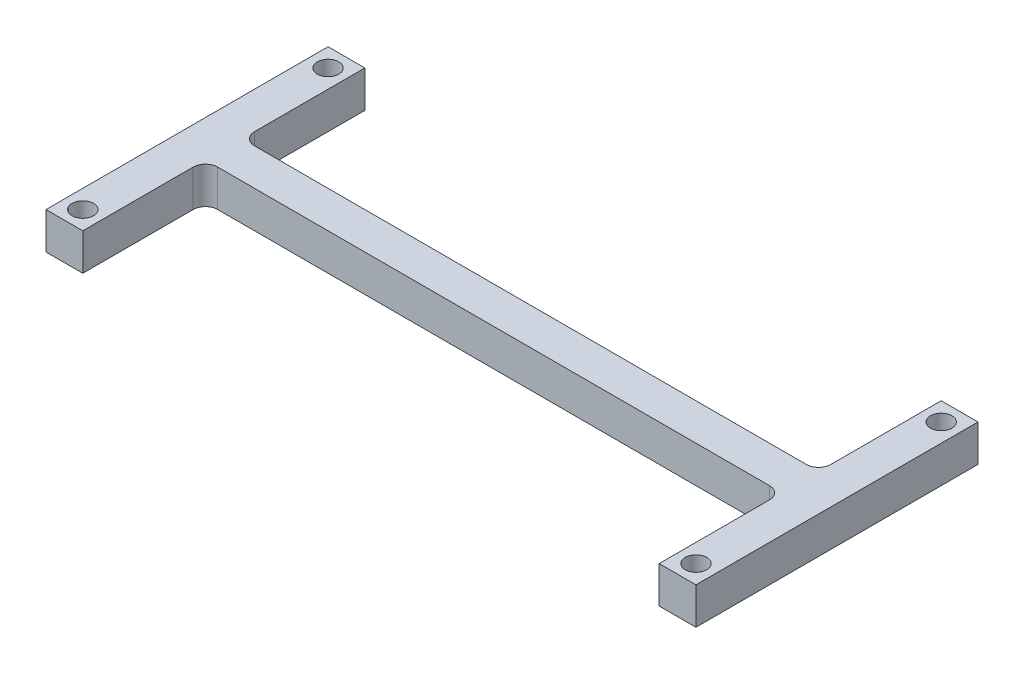
ISO-10303-21;
HEADER;
FILE_DESCRIPTION(('STEP AP214'),'2;1');
FILE_NAME('part.step','',(''),(''),'','','');
FILE_SCHEMA(('AUTOMOTIVE_DESIGN { 1 0 10303 214 1 1 1 1 }'));
ENDSEC;
DATA;
#1=APPLICATION_CONTEXT('core data for automotive mechanical design processes');
#2=APPLICATION_PROTOCOL_DEFINITION('international standard','automotive_design',2000,#1);
#3=PRODUCT_CONTEXT('',#1,'mechanical');
#4=PRODUCT('Part','Part','',(#3));
#5=PRODUCT_RELATED_PRODUCT_CATEGORY('part','',(#4));
#6=PRODUCT_DEFINITION_FORMATION('','',#4);
#7=PRODUCT_DEFINITION_CONTEXT('part definition',#1,'design');
#8=PRODUCT_DEFINITION('design','',#6,#7);
#9=PRODUCT_DEFINITION_SHAPE('','',#8);
#10=(LENGTH_UNIT() NAMED_UNIT(*) SI_UNIT(.MILLI.,.METRE.));
#11=(NAMED_UNIT(*) PLANE_ANGLE_UNIT() SI_UNIT($,.RADIAN.));
#12=(NAMED_UNIT(*) SI_UNIT($,.STERADIAN.) SOLID_ANGLE_UNIT());
#13=UNCERTAINTY_MEASURE_WITH_UNIT(LENGTH_MEASURE(1.E-05),#10,'distance_accuracy_value','');
#14=(GEOMETRIC_REPRESENTATION_CONTEXT(3) GLOBAL_UNCERTAINTY_ASSIGNED_CONTEXT((#13)) GLOBAL_UNIT_ASSIGNED_CONTEXT((#10,
#11,#12)) REPRESENTATION_CONTEXT('',''));
#15=CARTESIAN_POINT('',(0.,0.,0.));
#16=DIRECTION('',(0.,0.,1.));
#17=DIRECTION('',(1.,0.,0.));
#18=AXIS2_PLACEMENT_3D('',#15,#16,#17);
#19=CARTESIAN_POINT('',(-53.,6.,3.));
#20=DIRECTION('',(0.,0.,-1.));
#21=DIRECTION('',(-1.,0.,0.));
#22=AXIS2_PLACEMENT_3D('',#19,#20,#21);
#23=PLANE('',#22);
#24=DIRECTION('',(1.,0.,0.));
#25=VECTOR('',#24,1.);
#26=CARTESIAN_POINT('',(-53.,6.,3.));
#27=LINE('',#26,#25);
#28=CARTESIAN_POINT('',(-45.,6.,3.));
#29=VERTEX_POINT('',#28);
#30=CARTESIAN_POINT('',(45.,6.,3.));
#31=VERTEX_POINT('',#30);
#32=EDGE_CURVE('E300',#29,#31,#27,.T.);
#33=ORIENTED_EDGE('',*,*,#32,.F.);
#34=DIRECTION('',(0.,1.,0.));
#35=VECTOR('',#34,1.);
#36=CARTESIAN_POINT('',(-45.,6.,3.));
#37=LINE('',#36,#35);
#38=CARTESIAN_POINT('',(-45.,0.,3.));
#39=VERTEX_POINT('',#38);
#40=EDGE_CURVE('E324',#29,#39,#37,.F.);
#41=ORIENTED_EDGE('',*,*,#40,.T.);
#42=DIRECTION('',(1.,0.,0.));
#43=VECTOR('',#42,1.);
#44=CARTESIAN_POINT('',(-53.,0.,3.));
#45=LINE('',#44,#43);
#46=CARTESIAN_POINT('',(45.,0.,3.));
#47=VERTEX_POINT('',#46);
#48=EDGE_CURVE('E294',#39,#47,#45,.T.);
#49=ORIENTED_EDGE('',*,*,#48,.T.);
#50=DIRECTION('',(0.,1.,0.));
#51=VECTOR('',#50,1.);
#52=CARTESIAN_POINT('',(45.,6.,3.));
#53=LINE('',#52,#51);
#54=EDGE_CURVE('E320',#47,#31,#53,.T.);
#55=ORIENTED_EDGE('',*,*,#54,.T.);
#56=EDGE_LOOP('',(#33,#41,#49,#55));
#57=FACE_BOUND('',#56,.T.);
#58=ADVANCED_FACE('F44',(#57),#23,.F.);
#59=CARTESIAN_POINT('',(53.,6.,3.));
#60=DIRECTION('',(-1.,0.,0.));
#61=DIRECTION('',(0.,0.,1.));
#62=AXIS2_PLACEMENT_3D('',#59,#60,#61);
#63=PLANE('',#62);
#64=DIRECTION('',(0.,0.,-1.));
#65=VECTOR('',#64,1.);
#66=CARTESIAN_POINT('',(53.,0.,3.));
#67=LINE('',#66,#65);
#68=CARTESIAN_POINT('',(53.,0.,23.));
#69=VERTEX_POINT('',#68);
#70=CARTESIAN_POINT('',(53.,0.,-23.));
#71=VERTEX_POINT('',#70);
#72=EDGE_CURVE('E287',#69,#71,#67,.T.);
#73=ORIENTED_EDGE('',*,*,#72,.T.);
#74=DIRECTION('',(0.,1.,0.));
#75=VECTOR('',#74,1.);
#76=CARTESIAN_POINT('',(53.,0.,-23.));
#77=LINE('',#76,#75);
#78=CARTESIAN_POINT('',(53.,6.,-23.));
#79=VERTEX_POINT('',#78);
#80=EDGE_CURVE('E168',#71,#79,#77,.T.);
#81=ORIENTED_EDGE('',*,*,#80,.T.);
#82=DIRECTION('',(0.,0.,-1.));
#83=VECTOR('',#82,1.);
#84=CARTESIAN_POINT('',(53.,6.,3.));
#85=LINE('',#84,#83);
#86=CARTESIAN_POINT('',(53.,6.,23.));
#87=VERTEX_POINT('',#86);
#88=EDGE_CURVE('E175',#87,#79,#85,.T.);
#89=ORIENTED_EDGE('',*,*,#88,.F.);
#90=DIRECTION('',(0.,1.,0.));
#91=VECTOR('',#90,1.);
#92=CARTESIAN_POINT('',(53.,0.,23.));
#93=LINE('',#92,#91);
#94=EDGE_CURVE('E197',#69,#87,#93,.T.);
#95=ORIENTED_EDGE('',*,*,#94,.F.);
#96=EDGE_LOOP('',(#73,#81,#89,#95));
#97=FACE_BOUND('',#96,.T.);
#98=ADVANCED_FACE('F415',(#97),#63,.F.);
#99=CARTESIAN_POINT('',(-53.,6.,-3.));
#100=DIRECTION('',(0.,0.,1.));
#101=DIRECTION('',(1.,0.,0.));
#102=AXIS2_PLACEMENT_3D('',#99,#100,#101);
#103=PLANE('',#102);
#104=DIRECTION('',(-1.,0.,0.));
#105=VECTOR('',#104,1.);
#106=CARTESIAN_POINT('',(-53.,6.,-3.));
#107=LINE('',#106,#105);
#108=CARTESIAN_POINT('',(45.,6.,-3.));
#109=VERTEX_POINT('',#108);
#110=CARTESIAN_POINT('',(-45.,6.,-3.));
#111=VERTEX_POINT('',#110);
#112=EDGE_CURVE('E293',#109,#111,#107,.T.);
#113=ORIENTED_EDGE('',*,*,#112,.F.);
#114=DIRECTION('',(0.,1.,0.));
#115=VECTOR('',#114,1.);
#116=CARTESIAN_POINT('',(45.,6.,-3.));
#117=LINE('',#116,#115);
#118=CARTESIAN_POINT('',(45.,0.,-3.));
#119=VERTEX_POINT('',#118);
#120=EDGE_CURVE('E336',#109,#119,#117,.F.);
#121=ORIENTED_EDGE('',*,*,#120,.T.);
#122=DIRECTION('',(-1.,0.,0.));
#123=VECTOR('',#122,1.);
#124=CARTESIAN_POINT('',(-53.,0.,-3.));
#125=LINE('',#124,#123);
#126=CARTESIAN_POINT('',(-45.,0.,-3.));
#127=VERTEX_POINT('',#126);
#128=EDGE_CURVE('E307',#119,#127,#125,.T.);
#129=ORIENTED_EDGE('',*,*,#128,.T.);
#130=DIRECTION('',(0.,1.,0.));
#131=VECTOR('',#130,1.);
#132=CARTESIAN_POINT('',(-45.,6.,-3.));
#133=LINE('',#132,#131);
#134=EDGE_CURVE('E332',#127,#111,#133,.T.);
#135=ORIENTED_EDGE('',*,*,#134,.T.);
#136=EDGE_LOOP('',(#113,#121,#129,#135));
#137=FACE_BOUND('',#136,.T.);
#138=ADVANCED_FACE('F369',(#137),#103,.F.);
#139=CARTESIAN_POINT('',(-53.,6.,3.));
#140=DIRECTION('',(1.,0.,0.));
#141=DIRECTION('',(0.,0.,-1.));
#142=AXIS2_PLACEMENT_3D('',#139,#140,#141);
#143=PLANE('',#142);
#144=DIRECTION('',(0.,0.,1.));
#145=VECTOR('',#144,1.);
#146=CARTESIAN_POINT('',(-53.,0.,3.));
#147=LINE('',#146,#145);
#148=CARTESIAN_POINT('',(-53.,0.,-23.));
#149=VERTEX_POINT('',#148);
#150=CARTESIAN_POINT('',(-53.,0.,23.));
#151=VERTEX_POINT('',#150);
#152=EDGE_CURVE('E311',#149,#151,#147,.T.);
#153=ORIENTED_EDGE('',*,*,#152,.T.);
#154=DIRECTION('',(0.,1.,0.));
#155=VECTOR('',#154,1.);
#156=CARTESIAN_POINT('',(-53.,0.,23.));
#157=LINE('',#156,#155);
#158=CARTESIAN_POINT('',(-53.,6.,23.));
#159=VERTEX_POINT('',#158);
#160=EDGE_CURVE('E230',#151,#159,#157,.T.);
#161=ORIENTED_EDGE('',*,*,#160,.T.);
#162=DIRECTION('',(0.,0.,1.));
#163=VECTOR('',#162,1.);
#164=CARTESIAN_POINT('',(-53.,6.,3.));
#165=LINE('',#164,#163);
#166=CARTESIAN_POINT('',(-53.,6.,-23.));
#167=VERTEX_POINT('',#166);
#168=EDGE_CURVE('E297',#167,#159,#165,.T.);
#169=ORIENTED_EDGE('',*,*,#168,.F.);
#170=DIRECTION('',(0.,1.,0.));
#171=VECTOR('',#170,1.);
#172=CARTESIAN_POINT('',(-53.,0.,-23.));
#173=LINE('',#172,#171);
#174=EDGE_CURVE('E283',#149,#167,#173,.T.);
#175=ORIENTED_EDGE('',*,*,#174,.F.);
#176=EDGE_LOOP('',(#153,#161,#169,#175));
#177=FACE_BOUND('',#176,.T.);
#178=ADVANCED_FACE('F383',(#177),#143,.F.);
#179=CARTESIAN_POINT('',(0.,6.,0.));
#180=DIRECTION('',(0.,-1.,0.));
#181=DIRECTION('',(0.,0.,-1.));
#182=AXIS2_PLACEMENT_3D('',#179,#180,#181);
#183=PLANE('',#182);
#184=ORIENTED_EDGE('',*,*,#88,.T.);
#185=DIRECTION('',(-1.,0.,0.));
#186=VECTOR('',#185,1.);
#187=CARTESIAN_POINT('',(53.,6.,-23.));
#188=LINE('',#187,#186);
#189=CARTESIAN_POINT('',(47.,6.,-23.));
#190=VERTEX_POINT('',#189);
#191=EDGE_CURVE('E160',#79,#190,#188,.T.);
#192=ORIENTED_EDGE('',*,*,#191,.T.);
#193=DIRECTION('',(0.,0.,1.));
#194=VECTOR('',#193,1.);
#195=CARTESIAN_POINT('',(47.,6.,-3.));
#196=LINE('',#195,#194);
#197=CARTESIAN_POINT('',(47.,6.,-5.));
#198=VERTEX_POINT('',#197);
#199=EDGE_CURVE('E173',#190,#198,#196,.T.);
#200=ORIENTED_EDGE('',*,*,#199,.T.);
#201=CARTESIAN_POINT('',(45.,6.,-5.));
#202=DIRECTION('',(0.,-1.,0.));
#203=DIRECTION('',(0.,0.,-1.));
#204=AXIS2_PLACEMENT_3D('',#201,#202,#203);
#205=CIRCLE('',#204,2.);
#206=EDGE_CURVE('E353',#198,#109,#205,.T.);
#207=ORIENTED_EDGE('',*,*,#206,.T.);
#208=ORIENTED_EDGE('',*,*,#112,.T.);
#209=CARTESIAN_POINT('',(-45.,6.,-5.));
#210=DIRECTION('',(0.,-1.,0.));
#211=DIRECTION('',(0.,0.,-1.));
#212=AXIS2_PLACEMENT_3D('',#209,#210,#211);
#213=CIRCLE('',#212,2.);
#214=CARTESIAN_POINT('',(-47.,6.,-5.));
#215=VERTEX_POINT('',#214);
#216=EDGE_CURVE('E53',#111,#215,#213,.T.);
#217=ORIENTED_EDGE('',*,*,#216,.T.);
#218=DIRECTION('',(0.,0.,-1.));
#219=VECTOR('',#218,1.);
#220=CARTESIAN_POINT('',(-47.,6.,-3.));
#221=LINE('',#220,#219);
#222=CARTESIAN_POINT('',(-47.,6.,-23.));
#223=VERTEX_POINT('',#222);
#224=EDGE_CURVE('E265',#215,#223,#221,.T.);
#225=ORIENTED_EDGE('',*,*,#224,.T.);
#226=DIRECTION('',(-1.,0.,0.));
#227=VECTOR('',#226,1.);
#228=CARTESIAN_POINT('',(-53.,6.,-23.));
#229=LINE('',#228,#227);
#230=EDGE_CURVE('E273',#223,#167,#229,.T.);
#231=ORIENTED_EDGE('',*,*,#230,.T.);
#232=ORIENTED_EDGE('',*,*,#168,.T.);
#233=DIRECTION('',(1.,0.,0.));
#234=VECTOR('',#233,1.);
#235=CARTESIAN_POINT('',(-53.,6.,23.));
#236=LINE('',#235,#234);
#237=CARTESIAN_POINT('',(-47.,6.,23.));
#238=VERTEX_POINT('',#237);
#239=EDGE_CURVE('E241',#159,#238,#236,.T.);
#240=ORIENTED_EDGE('',*,*,#239,.T.);
#241=DIRECTION('',(0.,0.,-1.));
#242=VECTOR('',#241,1.);
#243=CARTESIAN_POINT('',(-47.,6.,3.));
#244=LINE('',#243,#242);
#245=CARTESIAN_POINT('',(-47.,6.,5.));
#246=VERTEX_POINT('',#245);
#247=EDGE_CURVE('E237',#238,#246,#244,.T.);
#248=ORIENTED_EDGE('',*,*,#247,.T.);
#249=CARTESIAN_POINT('',(-45.,6.,5.));
#250=DIRECTION('',(0.,-1.,0.));
#251=DIRECTION('',(0.,0.,-1.));
#252=AXIS2_PLACEMENT_3D('',#249,#250,#251);
#253=CIRCLE('',#252,2.);
#254=EDGE_CURVE('E341',#246,#29,#253,.T.);
#255=ORIENTED_EDGE('',*,*,#254,.T.);
#256=ORIENTED_EDGE('',*,*,#32,.T.);
#257=CARTESIAN_POINT('',(45.,6.,5.));
#258=DIRECTION('',(0.,-1.,0.));
#259=DIRECTION('',(0.,0.,-1.));
#260=AXIS2_PLACEMENT_3D('',#257,#258,#259);
#261=CIRCLE('',#260,2.);
#262=CARTESIAN_POINT('',(47.,6.,5.));
#263=VERTEX_POINT('',#262);
#264=EDGE_CURVE('E347',#31,#263,#261,.T.);
#265=ORIENTED_EDGE('',*,*,#264,.T.);
#266=DIRECTION('',(0.,0.,1.));
#267=VECTOR('',#266,1.);
#268=CARTESIAN_POINT('',(47.,6.,3.));
#269=LINE('',#268,#267);
#270=CARTESIAN_POINT('',(47.,6.,23.));
#271=VERTEX_POINT('',#270);
#272=EDGE_CURVE('E212',#263,#271,#269,.T.);
#273=ORIENTED_EDGE('',*,*,#272,.T.);
#274=DIRECTION('',(1.,0.,0.));
#275=VECTOR('',#274,1.);
#276=CARTESIAN_POINT('',(53.,6.,23.));
#277=LINE('',#276,#275);
#278=EDGE_CURVE('E209',#271,#87,#277,.T.);
#279=ORIENTED_EDGE('',*,*,#278,.T.);
#280=EDGE_LOOP('',(#184,#192,#200,#207,#208,#217,#225,#231,#232,#240,#248,#255,#256,#265,#273,#279));
#281=FACE_BOUND('',#280,.T.);
#282=CARTESIAN_POINT('',(-50.,6.,-20.));
#283=DIRECTION('',(0.,1.,0.));
#284=DIRECTION('',(0.,0.,1.));
#285=AXIS2_PLACEMENT_3D('',#282,#283,#284);
#286=CIRCLE('',#285,1.75);
#287=CARTESIAN_POINT('',(-50.,6.,-18.25));
#288=VERTEX_POINT('',#287);
#289=EDGE_CURVE('E257',#288,#288,#286,.T.);
#290=ORIENTED_EDGE('',*,*,#289,.F.);
#291=EDGE_LOOP('',(#290));
#292=FACE_BOUND('',#291,.T.);
#293=CARTESIAN_POINT('',(-50.,6.,20.));
#294=DIRECTION('',(0.,1.,0.));
#295=DIRECTION('',(0.,0.,-1.));
#296=AXIS2_PLACEMENT_3D('',#293,#294,#295);
#297=CIRCLE('',#296,1.75);
#298=CARTESIAN_POINT('',(-50.,6.,18.25));
#299=VERTEX_POINT('',#298);
#300=EDGE_CURVE('E253',#299,#299,#297,.T.);
#301=ORIENTED_EDGE('',*,*,#300,.F.);
#302=EDGE_LOOP('',(#301));
#303=FACE_BOUND('',#302,.T.);
#304=CARTESIAN_POINT('',(50.,6.,20.));
#305=DIRECTION('',(0.,1.,0.));
#306=DIRECTION('',(0.,0.,1.));
#307=AXIS2_PLACEMENT_3D('',#304,#305,#306);
#308=CIRCLE('',#307,1.75);
#309=CARTESIAN_POINT('',(50.,6.,21.75));
#310=VERTEX_POINT('',#309);
#311=EDGE_CURVE('E222',#310,#310,#308,.T.);
#312=ORIENTED_EDGE('',*,*,#311,.F.);
#313=EDGE_LOOP('',(#312));
#314=FACE_BOUND('',#313,.T.);
#315=CARTESIAN_POINT('',(50.,6.,-20.));
#316=DIRECTION('',(0.,1.,0.));
#317=DIRECTION('',(0.,0.,-1.));
#318=AXIS2_PLACEMENT_3D('',#315,#316,#317);
#319=CIRCLE('',#318,1.75);
#320=CARTESIAN_POINT('',(50.,6.,-21.75));
#321=VERTEX_POINT('',#320);
#322=EDGE_CURVE('E193',#321,#321,#319,.T.);
#323=ORIENTED_EDGE('',*,*,#322,.F.);
#324=EDGE_LOOP('',(#323));
#325=FACE_BOUND('',#324,.T.);
#326=ADVANCED_FACE('F171',(#281,#292,#303,#314,#325),#183,.F.);
#327=CARTESIAN_POINT('',(0.,0.,0.));
#328=DIRECTION('',(0.,-1.,0.));
#329=DIRECTION('',(0.,0.,-1.));
#330=AXIS2_PLACEMENT_3D('',#327,#328,#329);
#331=PLANE('',#330);
#332=ORIENTED_EDGE('',*,*,#72,.F.);
#333=DIRECTION('',(1.,0.,0.));
#334=VECTOR('',#333,1.);
#335=CARTESIAN_POINT('',(53.,0.,23.));
#336=LINE('',#335,#334);
#337=CARTESIAN_POINT('',(47.,0.,23.));
#338=VERTEX_POINT('',#337);
#339=EDGE_CURVE('E205',#338,#69,#336,.T.);
#340=ORIENTED_EDGE('',*,*,#339,.F.);
#341=DIRECTION('',(0.,0.,1.));
#342=VECTOR('',#341,1.);
#343=CARTESIAN_POINT('',(47.,0.,3.));
#344=LINE('',#343,#342);
#345=CARTESIAN_POINT('',(47.,0.,5.));
#346=VERTEX_POINT('',#345);
#347=EDGE_CURVE('E213',#346,#338,#344,.T.);
#348=ORIENTED_EDGE('',*,*,#347,.F.);
#349=CARTESIAN_POINT('',(45.,0.,5.));
#350=DIRECTION('',(0.,-1.,0.));
#351=DIRECTION('',(0.,0.,-1.));
#352=AXIS2_PLACEMENT_3D('',#349,#350,#351);
#353=CIRCLE('',#352,2.);
#354=EDGE_CURVE('E350',#346,#47,#353,.F.);
#355=ORIENTED_EDGE('',*,*,#354,.T.);
#356=ORIENTED_EDGE('',*,*,#48,.F.);
#357=CARTESIAN_POINT('',(-45.,0.,5.));
#358=DIRECTION('',(0.,-1.,0.));
#359=DIRECTION('',(0.,0.,-1.));
#360=AXIS2_PLACEMENT_3D('',#357,#358,#359);
#361=CIRCLE('',#360,2.);
#362=CARTESIAN_POINT('',(-47.,0.,5.));
#363=VERTEX_POINT('',#362);
#364=EDGE_CURVE('E344',#39,#363,#361,.F.);
#365=ORIENTED_EDGE('',*,*,#364,.T.);
#366=DIRECTION('',(0.,0.,-1.));
#367=VECTOR('',#366,1.);
#368=CARTESIAN_POINT('',(-47.,0.,3.));
#369=LINE('',#368,#367);
#370=CARTESIAN_POINT('',(-47.,0.,23.));
#371=VERTEX_POINT('',#370);
#372=EDGE_CURVE('E234',#371,#363,#369,.T.);
#373=ORIENTED_EDGE('',*,*,#372,.F.);
#374=DIRECTION('',(1.,0.,0.));
#375=VECTOR('',#374,1.);
#376=CARTESIAN_POINT('',(-53.,0.,23.));
#377=LINE('',#376,#375);
#378=EDGE_CURVE('E242',#151,#371,#377,.T.);
#379=ORIENTED_EDGE('',*,*,#378,.F.);
#380=ORIENTED_EDGE('',*,*,#152,.F.);
#381=DIRECTION('',(-1.,0.,0.));
#382=VECTOR('',#381,1.);
#383=CARTESIAN_POINT('',(-53.,0.,-23.));
#384=LINE('',#383,#382);
#385=CARTESIAN_POINT('',(-47.,0.,-23.));
#386=VERTEX_POINT('',#385);
#387=EDGE_CURVE('E272',#386,#149,#384,.T.);
#388=ORIENTED_EDGE('',*,*,#387,.F.);
#389=DIRECTION('',(0.,0.,-1.));
#390=VECTOR('',#389,1.);
#391=CARTESIAN_POINT('',(-47.,0.,-3.));
#392=LINE('',#391,#390);
#393=CARTESIAN_POINT('',(-47.,0.,-5.));
#394=VERTEX_POINT('',#393);
#395=EDGE_CURVE('E269',#394,#386,#392,.T.);
#396=ORIENTED_EDGE('',*,*,#395,.F.);
#397=CARTESIAN_POINT('',(-45.,0.,-5.));
#398=DIRECTION('',(0.,-1.,0.));
#399=DIRECTION('',(0.,0.,-1.));
#400=AXIS2_PLACEMENT_3D('',#397,#398,#399);
#401=CIRCLE('',#400,2.);
#402=EDGE_CURVE('E11',#394,#127,#401,.F.);
#403=ORIENTED_EDGE('',*,*,#402,.T.);
#404=ORIENTED_EDGE('',*,*,#128,.F.);
#405=CARTESIAN_POINT('',(45.,0.,-5.));
#406=DIRECTION('',(0.,-1.,0.));
#407=DIRECTION('',(0.,0.,-1.));
#408=AXIS2_PLACEMENT_3D('',#405,#406,#407);
#409=CIRCLE('',#408,2.);
#410=CARTESIAN_POINT('',(47.,0.,-5.));
#411=VERTEX_POINT('',#410);
#412=EDGE_CURVE('E356',#119,#411,#409,.F.);
#413=ORIENTED_EDGE('',*,*,#412,.T.);
#414=DIRECTION('',(0.,0.,1.));
#415=VECTOR('',#414,1.);
#416=CARTESIAN_POINT('',(47.,0.,-3.));
#417=LINE('',#416,#415);
#418=CARTESIAN_POINT('',(47.,0.,-23.));
#419=VERTEX_POINT('',#418);
#420=EDGE_CURVE('E187',#419,#411,#417,.T.);
#421=ORIENTED_EDGE('',*,*,#420,.F.);
#422=DIRECTION('',(-1.,0.,0.));
#423=VECTOR('',#422,1.);
#424=CARTESIAN_POINT('',(53.,0.,-23.));
#425=LINE('',#424,#423);
#426=EDGE_CURVE('E162',#71,#419,#425,.T.);
#427=ORIENTED_EDGE('',*,*,#426,.F.);
#428=EDGE_LOOP('',(#332,#340,#348,#355,#356,#365,#373,#379,#380,#388,#396,#403,#404,#413,#421,#427));
#429=FACE_BOUND('',#428,.T.);
#430=CARTESIAN_POINT('',(-50.,0.,-20.));
#431=DIRECTION('',(0.,1.,0.));
#432=DIRECTION('',(0.,0.,1.));
#433=AXIS2_PLACEMENT_3D('',#430,#431,#432);
#434=CIRCLE('',#433,1.75);
#435=CARTESIAN_POINT('',(-50.,0.,-18.25));
#436=VERTEX_POINT('',#435);
#437=EDGE_CURVE('E261',#436,#436,#434,.T.);
#438=ORIENTED_EDGE('',*,*,#437,.T.);
#439=EDGE_LOOP('',(#438));
#440=FACE_BOUND('',#439,.T.);
#441=CARTESIAN_POINT('',(-50.,0.,20.));
#442=DIRECTION('',(0.,1.,0.));
#443=DIRECTION('',(0.,0.,-1.));
#444=AXIS2_PLACEMENT_3D('',#441,#442,#443);
#445=CIRCLE('',#444,1.75);
#446=CARTESIAN_POINT('',(-50.,0.,18.25));
#447=VERTEX_POINT('',#446);
#448=EDGE_CURVE('E246',#447,#447,#445,.T.);
#449=ORIENTED_EDGE('',*,*,#448,.T.);
#450=EDGE_LOOP('',(#449));
#451=FACE_BOUND('',#450,.T.);
#452=CARTESIAN_POINT('',(50.,0.,20.));
#453=DIRECTION('',(0.,1.,0.));
#454=DIRECTION('',(0.,0.,1.));
#455=AXIS2_PLACEMENT_3D('',#452,#453,#454);
#456=CIRCLE('',#455,1.75);
#457=CARTESIAN_POINT('',(50.,0.,21.75));
#458=VERTEX_POINT('',#457);
#459=EDGE_CURVE('E216',#458,#458,#456,.T.);
#460=ORIENTED_EDGE('',*,*,#459,.T.);
#461=EDGE_LOOP('',(#460));
#462=FACE_BOUND('',#461,.T.);
#463=CARTESIAN_POINT('',(50.,0.,-20.));
#464=DIRECTION('',(0.,1.,0.));
#465=DIRECTION('',(0.,0.,-1.));
#466=AXIS2_PLACEMENT_3D('',#463,#464,#465);
#467=CIRCLE('',#466,1.75);
#468=CARTESIAN_POINT('',(50.,0.,-21.75));
#469=VERTEX_POINT('',#468);
#470=EDGE_CURVE('E178',#469,#469,#467,.T.);
#471=ORIENTED_EDGE('',*,*,#470,.T.);
#472=EDGE_LOOP('',(#471));
#473=FACE_BOUND('',#472,.T.);
#474=ADVANCED_FACE('F362',(#429,#440,#451,#462,#473),#331,.T.);
#475=CARTESIAN_POINT('',(-53.,0.,-23.));
#476=DIRECTION('',(0.,0.,-1.));
#477=DIRECTION('',(-1.,0.,0.));
#478=AXIS2_PLACEMENT_3D('',#475,#476,#477);
#479=PLANE('',#478);
#480=ORIENTED_EDGE('',*,*,#230,.F.);
#481=DIRECTION('',(0.,1.,0.));
#482=VECTOR('',#481,1.);
#483=CARTESIAN_POINT('',(-47.,0.,-23.));
#484=LINE('',#483,#482);
#485=EDGE_CURVE('E277',#386,#223,#484,.T.);
#486=ORIENTED_EDGE('',*,*,#485,.F.);
#487=ORIENTED_EDGE('',*,*,#387,.T.);
#488=ORIENTED_EDGE('',*,*,#174,.T.);
#489=EDGE_LOOP('',(#480,#486,#487,#488));
#490=FACE_BOUND('',#489,.T.);
#491=ADVANCED_FACE('F378',(#490),#479,.T.);
#492=CARTESIAN_POINT('',(-47.,0.,-3.));
#493=DIRECTION('',(1.,0.,0.));
#494=DIRECTION('',(0.,0.,-1.));
#495=AXIS2_PLACEMENT_3D('',#492,#493,#494);
#496=PLANE('',#495);
#497=ORIENTED_EDGE('',*,*,#224,.F.);
#498=DIRECTION('',(0.,1.,0.));
#499=VECTOR('',#498,1.);
#500=CARTESIAN_POINT('',(-47.,0.,-5.));
#501=LINE('',#500,#499);
#502=EDGE_CURVE('E60',#215,#394,#501,.F.);
#503=ORIENTED_EDGE('',*,*,#502,.T.);
#504=ORIENTED_EDGE('',*,*,#395,.T.);
#505=ORIENTED_EDGE('',*,*,#485,.T.);
#506=EDGE_LOOP('',(#497,#503,#504,#505));
#507=FACE_BOUND('',#506,.T.);
#508=ADVANCED_FACE('F375',(#507),#496,.T.);
#509=CARTESIAN_POINT('',(-50.,0.,-20.));
#510=DIRECTION('',(0.,1.,0.));
#511=DIRECTION('',(0.,0.,1.));
#512=AXIS2_PLACEMENT_3D('',#509,#510,#511);
#513=CYLINDRICAL_SURFACE('',#512,1.75);
#514=ORIENTED_EDGE('',*,*,#437,.F.);
#515=EDGE_LOOP('',(#514));
#516=FACE_BOUND('',#515,.T.);
#517=ORIENTED_EDGE('',*,*,#289,.T.);
#518=EDGE_LOOP('',(#517));
#519=FACE_BOUND('',#518,.T.);
#520=ADVANCED_FACE('F534',(#516,#519),#513,.F.);
#521=CARTESIAN_POINT('',(-47.,0.,3.));
#522=DIRECTION('',(1.,0.,0.));
#523=DIRECTION('',(0.,0.,-1.));
#524=AXIS2_PLACEMENT_3D('',#521,#522,#523);
#525=PLANE('',#524);
#526=ORIENTED_EDGE('',*,*,#372,.T.);
#527=DIRECTION('',(0.,1.,0.));
#528=VECTOR('',#527,1.);
#529=CARTESIAN_POINT('',(-47.,0.,5.));
#530=LINE('',#529,#528);
#531=EDGE_CURVE('E304',#363,#246,#530,.T.);
#532=ORIENTED_EDGE('',*,*,#531,.T.);
#533=ORIENTED_EDGE('',*,*,#247,.F.);
#534=DIRECTION('',(0.,1.,0.));
#535=VECTOR('',#534,1.);
#536=CARTESIAN_POINT('',(-47.,0.,23.));
#537=LINE('',#536,#535);
#538=EDGE_CURVE('E226',#371,#238,#537,.T.);
#539=ORIENTED_EDGE('',*,*,#538,.F.);
#540=EDGE_LOOP('',(#526,#532,#533,#539));
#541=FACE_BOUND('',#540,.T.);
#542=ADVANCED_FACE('F390',(#541),#525,.T.);
#543=CARTESIAN_POINT('',(-53.,0.,23.));
#544=DIRECTION('',(0.,0.,1.));
#545=DIRECTION('',(1.,0.,0.));
#546=AXIS2_PLACEMENT_3D('',#543,#544,#545);
#547=PLANE('',#546);
#548=ORIENTED_EDGE('',*,*,#239,.F.);
#549=ORIENTED_EDGE('',*,*,#160,.F.);
#550=ORIENTED_EDGE('',*,*,#378,.T.);
#551=ORIENTED_EDGE('',*,*,#538,.T.);
#552=EDGE_LOOP('',(#548,#549,#550,#551));
#553=FACE_BOUND('',#552,.T.);
#554=ADVANCED_FACE('F386',(#553),#547,.T.);
#555=CARTESIAN_POINT('',(-50.,0.,20.));
#556=DIRECTION('',(0.,1.,0.));
#557=DIRECTION('',(0.,0.,1.));
#558=AXIS2_PLACEMENT_3D('',#555,#556,#557);
#559=CYLINDRICAL_SURFACE('',#558,1.75);
#560=ORIENTED_EDGE('',*,*,#448,.F.);
#561=EDGE_LOOP('',(#560));
#562=FACE_BOUND('',#561,.T.);
#563=ORIENTED_EDGE('',*,*,#300,.T.);
#564=EDGE_LOOP('',(#563));
#565=FACE_BOUND('',#564,.T.);
#566=ADVANCED_FACE('F508',(#562,#565),#559,.F.);
#567=CARTESIAN_POINT('',(53.,0.,23.));
#568=DIRECTION('',(0.,0.,1.));
#569=DIRECTION('',(1.,0.,0.));
#570=AXIS2_PLACEMENT_3D('',#567,#568,#569);
#571=PLANE('',#570);
#572=ORIENTED_EDGE('',*,*,#278,.F.);
#573=DIRECTION('',(0.,1.,0.));
#574=VECTOR('',#573,1.);
#575=CARTESIAN_POINT('',(47.,0.,23.));
#576=LINE('',#575,#574);
#577=EDGE_CURVE('E201',#338,#271,#576,.T.);
#578=ORIENTED_EDGE('',*,*,#577,.F.);
#579=ORIENTED_EDGE('',*,*,#339,.T.);
#580=ORIENTED_EDGE('',*,*,#94,.T.);
#581=EDGE_LOOP('',(#572,#578,#579,#580));
#582=FACE_BOUND('',#581,.T.);
#583=ADVANCED_FACE('F412',(#582),#571,.T.);
#584=CARTESIAN_POINT('',(47.,0.,3.));
#585=DIRECTION('',(-1.,0.,0.));
#586=DIRECTION('',(0.,0.,1.));
#587=AXIS2_PLACEMENT_3D('',#584,#585,#586);
#588=PLANE('',#587);
#589=ORIENTED_EDGE('',*,*,#272,.F.);
#590=DIRECTION('',(0.,1.,0.));
#591=VECTOR('',#590,1.);
#592=CARTESIAN_POINT('',(47.,0.,5.));
#593=LINE('',#592,#591);
#594=EDGE_CURVE('E327',#263,#346,#593,.F.);
#595=ORIENTED_EDGE('',*,*,#594,.T.);
#596=ORIENTED_EDGE('',*,*,#347,.T.);
#597=ORIENTED_EDGE('',*,*,#577,.T.);
#598=EDGE_LOOP('',(#589,#595,#596,#597));
#599=FACE_BOUND('',#598,.T.);
#600=ADVANCED_FACE('F407',(#599),#588,.T.);
#601=CARTESIAN_POINT('',(50.,0.,20.));
#602=DIRECTION('',(0.,1.,0.));
#603=DIRECTION('',(0.,0.,1.));
#604=AXIS2_PLACEMENT_3D('',#601,#602,#603);
#605=CYLINDRICAL_SURFACE('',#604,1.75);
#606=ORIENTED_EDGE('',*,*,#459,.F.);
#607=EDGE_LOOP('',(#606));
#608=FACE_BOUND('',#607,.T.);
#609=ORIENTED_EDGE('',*,*,#311,.T.);
#610=EDGE_LOOP('',(#609));
#611=FACE_BOUND('',#610,.T.);
#612=ADVANCED_FACE('F482',(#608,#611),#605,.F.);
#613=CARTESIAN_POINT('',(47.,0.,-3.));
#614=DIRECTION('',(-1.,0.,0.));
#615=DIRECTION('',(0.,0.,1.));
#616=AXIS2_PLACEMENT_3D('',#613,#614,#615);
#617=PLANE('',#616);
#618=ORIENTED_EDGE('',*,*,#420,.T.);
#619=DIRECTION('',(0.,1.,0.));
#620=VECTOR('',#619,1.);
#621=CARTESIAN_POINT('',(47.,0.,-5.));
#622=LINE('',#621,#620);
#623=EDGE_CURVE('E183',#411,#198,#622,.T.);
#624=ORIENTED_EDGE('',*,*,#623,.T.);
#625=ORIENTED_EDGE('',*,*,#199,.F.);
#626=DIRECTION('',(0.,1.,0.));
#627=VECTOR('',#626,1.);
#628=CARTESIAN_POINT('',(47.,0.,-23.));
#629=LINE('',#628,#627);
#630=EDGE_CURVE('E156',#419,#190,#629,.T.);
#631=ORIENTED_EDGE('',*,*,#630,.F.);
#632=EDGE_LOOP('',(#618,#624,#625,#631));
#633=FACE_BOUND('',#632,.T.);
#634=ADVANCED_FACE('F181',(#633),#617,.T.);
#635=CARTESIAN_POINT('',(53.,0.,-23.));
#636=DIRECTION('',(0.,0.,-1.));
#637=DIRECTION('',(-1.,0.,0.));
#638=AXIS2_PLACEMENT_3D('',#635,#636,#637);
#639=PLANE('',#638);
#640=ORIENTED_EDGE('',*,*,#191,.F.);
#641=ORIENTED_EDGE('',*,*,#80,.F.);
#642=ORIENTED_EDGE('',*,*,#426,.T.);
#643=ORIENTED_EDGE('',*,*,#630,.T.);
#644=EDGE_LOOP('',(#640,#641,#642,#643));
#645=FACE_BOUND('',#644,.T.);
#646=ADVANCED_FACE('F158',(#645),#639,.T.);
#647=CARTESIAN_POINT('',(50.,0.,-20.));
#648=DIRECTION('',(0.,1.,0.));
#649=DIRECTION('',(0.,0.,1.));
#650=AXIS2_PLACEMENT_3D('',#647,#648,#649);
#651=CYLINDRICAL_SURFACE('',#650,1.75);
#652=ORIENTED_EDGE('',*,*,#470,.F.);
#653=EDGE_LOOP('',(#652));
#654=FACE_BOUND('',#653,.T.);
#655=ORIENTED_EDGE('',*,*,#322,.T.);
#656=EDGE_LOOP('',(#655));
#657=FACE_BOUND('',#656,.T.);
#658=ADVANCED_FACE('F430',(#654,#657),#651,.F.);
#659=CARTESIAN_POINT('',(-45.,0.,5.));
#660=DIRECTION('',(0.,1.,0.));
#661=DIRECTION('',(0.,0.,1.));
#662=AXIS2_PLACEMENT_3D('',#659,#660,#661);
#663=CYLINDRICAL_SURFACE('',#662,2.);
#664=ORIENTED_EDGE('',*,*,#364,.F.);
#665=ORIENTED_EDGE('',*,*,#40,.F.);
#666=ORIENTED_EDGE('',*,*,#254,.F.);
#667=ORIENTED_EDGE('',*,*,#531,.F.);
#668=EDGE_LOOP('',(#664,#665,#666,#667));
#669=FACE_BOUND('',#668,.T.);
#670=ADVANCED_FACE('F399',(#669),#663,.F.);
#671=CARTESIAN_POINT('',(45.,6.,5.));
#672=DIRECTION('',(0.,1.,0.));
#673=DIRECTION('',(0.,0.,1.));
#674=AXIS2_PLACEMENT_3D('',#671,#672,#673);
#675=CYLINDRICAL_SURFACE('',#674,2.);
#676=ORIENTED_EDGE('',*,*,#354,.F.);
#677=ORIENTED_EDGE('',*,*,#594,.F.);
#678=ORIENTED_EDGE('',*,*,#264,.F.);
#679=ORIENTED_EDGE('',*,*,#54,.F.);
#680=EDGE_LOOP('',(#676,#677,#678,#679));
#681=FACE_BOUND('',#680,.T.);
#682=ADVANCED_FACE('F403',(#681),#675,.F.);
#683=CARTESIAN_POINT('',(45.,0.,-5.));
#684=DIRECTION('',(0.,1.,0.));
#685=DIRECTION('',(0.,0.,1.));
#686=AXIS2_PLACEMENT_3D('',#683,#684,#685);
#687=CYLINDRICAL_SURFACE('',#686,2.);
#688=ORIENTED_EDGE('',*,*,#412,.F.);
#689=ORIENTED_EDGE('',*,*,#120,.F.);
#690=ORIENTED_EDGE('',*,*,#206,.F.);
#691=ORIENTED_EDGE('',*,*,#623,.F.);
#692=EDGE_LOOP('',(#688,#689,#690,#691));
#693=FACE_BOUND('',#692,.T.);
#694=ADVANCED_FACE('F366',(#693),#687,.F.);
#695=CARTESIAN_POINT('',(-45.,6.,-5.));
#696=DIRECTION('',(0.,1.,0.));
#697=DIRECTION('',(0.,0.,1.));
#698=AXIS2_PLACEMENT_3D('',#695,#696,#697);
#699=CYLINDRICAL_SURFACE('',#698,2.);
#700=ORIENTED_EDGE('',*,*,#402,.F.);
#701=ORIENTED_EDGE('',*,*,#502,.F.);
#702=ORIENTED_EDGE('',*,*,#216,.F.);
#703=ORIENTED_EDGE('',*,*,#134,.F.);
#704=EDGE_LOOP('',(#700,#701,#702,#703));
#705=FACE_BOUND('',#704,.T.);
#706=ADVANCED_FACE('F46',(#705),#699,.F.);
#707=CLOSED_SHELL('',(#58,#98,#138,#178,#326,#474,#491,#508,#520,#542,#554,#566,#583,#600,#612,
#634,#646,#658,#670,#682,#694,#706));
#708=MANIFOLD_SOLID_BREP('B2',#707);
#709=ADVANCED_BREP_SHAPE_REPRESENTATION('',(#18,#708),#14);
#710=SHAPE_DEFINITION_REPRESENTATION(#9,#709);
ENDSEC;
END-ISO-10303-21;
